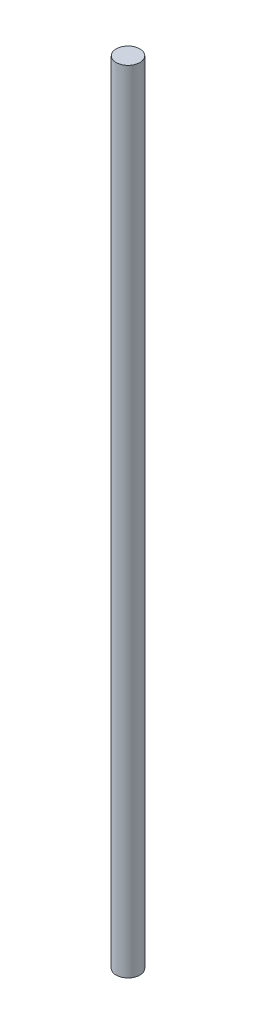
ISO-10303-21;
HEADER;
FILE_DESCRIPTION(('STEP AP214'),'2;1');
FILE_NAME('part.step','',(''),(''),'','','');
FILE_SCHEMA(('AUTOMOTIVE_DESIGN { 1 0 10303 214 1 1 1 1 }'));
ENDSEC;
DATA;
#1=APPLICATION_CONTEXT('core data for automotive mechanical design processes');
#2=APPLICATION_PROTOCOL_DEFINITION('international standard','automotive_design',2000,#1);
#3=PRODUCT_CONTEXT('',#1,'mechanical');
#4=PRODUCT('Part','Part','',(#3));
#5=PRODUCT_RELATED_PRODUCT_CATEGORY('part','',(#4));
#6=PRODUCT_DEFINITION_FORMATION('','',#4);
#7=PRODUCT_DEFINITION_CONTEXT('part definition',#1,'design');
#8=PRODUCT_DEFINITION('design','',#6,#7);
#9=PRODUCT_DEFINITION_SHAPE('','',#8);
#10=(LENGTH_UNIT() NAMED_UNIT(*) SI_UNIT(.MILLI.,.METRE.));
#11=(NAMED_UNIT(*) PLANE_ANGLE_UNIT() SI_UNIT($,.RADIAN.));
#12=(NAMED_UNIT(*) SI_UNIT($,.STERADIAN.) SOLID_ANGLE_UNIT());
#13=UNCERTAINTY_MEASURE_WITH_UNIT(LENGTH_MEASURE(1.E-05),#10,'distance_accuracy_value','');
#14=(GEOMETRIC_REPRESENTATION_CONTEXT(3) GLOBAL_UNCERTAINTY_ASSIGNED_CONTEXT((#13)) GLOBAL_UNIT_ASSIGNED_CONTEXT((#10,
#11,#12)) REPRESENTATION_CONTEXT('',''));
#15=CARTESIAN_POINT('',(0.,0.,0.));
#16=DIRECTION('',(0.,0.,1.));
#17=DIRECTION('',(1.,0.,0.));
#18=AXIS2_PLACEMENT_3D('',#15,#16,#17);
#19=CARTESIAN_POINT('',(0.,200.,0.));
#20=DIRECTION('',(0.,-1.,0.));
#21=DIRECTION('',(0.,0.,-1.));
#22=AXIS2_PLACEMENT_3D('',#19,#20,#21);
#23=CYLINDRICAL_SURFACE('',#22,3.);
#24=CARTESIAN_POINT('',(0.,200.,0.));
#25=DIRECTION('',(0.,1.,0.));
#26=DIRECTION('',(0.,0.,1.));
#27=AXIS2_PLACEMENT_3D('',#24,#25,#26);
#28=CIRCLE('',#27,3.);
#29=CARTESIAN_POINT('',(0.,200.,3.));
#30=VERTEX_POINT('',#29);
#31=EDGE_CURVE('E10',#30,#30,#28,.T.);
#32=ORIENTED_EDGE('',*,*,#31,.F.);
#33=EDGE_LOOP('',(#32));
#34=FACE_BOUND('',#33,.T.);
#35=CARTESIAN_POINT('',(0.,0.,0.));
#36=DIRECTION('',(0.,1.,0.));
#37=DIRECTION('',(0.,0.,1.));
#38=AXIS2_PLACEMENT_3D('',#35,#36,#37);
#39=CIRCLE('',#38,3.);
#40=CARTESIAN_POINT('',(0.,0.,3.));
#41=VERTEX_POINT('',#40);
#42=EDGE_CURVE('E36',#41,#41,#39,.T.);
#43=ORIENTED_EDGE('',*,*,#42,.T.);
#44=EDGE_LOOP('',(#43));
#45=FACE_BOUND('',#44,.T.);
#46=ADVANCED_FACE('F33',(#34,#45),#23,.T.);
#47=CARTESIAN_POINT('',(0.,200.,0.));
#48=DIRECTION('',(0.,1.,0.));
#49=DIRECTION('',(0.,0.,1.));
#50=AXIS2_PLACEMENT_3D('',#47,#48,#49);
#51=PLANE('',#50);
#52=ORIENTED_EDGE('',*,*,#31,.T.);
#53=EDGE_LOOP('',(#52));
#54=FACE_BOUND('',#53,.T.);
#55=ADVANCED_FACE('F48',(#54),#51,.T.);
#56=CARTESIAN_POINT('',(0.,0.,0.));
#57=DIRECTION('',(0.,1.,0.));
#58=DIRECTION('',(0.,0.,1.));
#59=AXIS2_PLACEMENT_3D('',#56,#57,#58);
#60=PLANE('',#59);
#61=ORIENTED_EDGE('',*,*,#42,.F.);
#62=EDGE_LOOP('',(#61));
#63=FACE_BOUND('',#62,.T.);
#64=ADVANCED_FACE('F46',(#63),#60,.F.);
#65=CLOSED_SHELL('',(#46,#55,#64));
#66=MANIFOLD_SOLID_BREP('B2',#65);
#67=ADVANCED_BREP_SHAPE_REPRESENTATION('',(#18,#66),#14);
#68=SHAPE_DEFINITION_REPRESENTATION(#9,#67);
ENDSEC;
END-ISO-10303-21;
